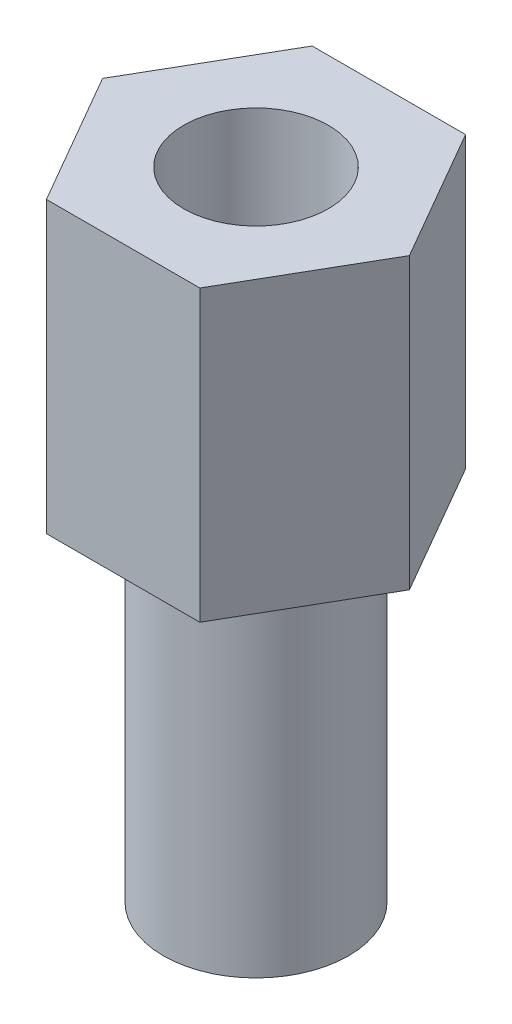
ISO-10303-21;
HEADER;
FILE_DESCRIPTION(('STEP AP214'),'2;1');
FILE_NAME('part.step','',(''),(''),'','','');
FILE_SCHEMA(('AUTOMOTIVE_DESIGN { 1 0 10303 214 1 1 1 1 }'));
ENDSEC;
DATA;
#1=APPLICATION_CONTEXT('core data for automotive mechanical design processes');
#2=APPLICATION_PROTOCOL_DEFINITION('international standard','automotive_design',2000,#1);
#3=PRODUCT_CONTEXT('',#1,'mechanical');
#4=PRODUCT('Part','Part','',(#3));
#5=PRODUCT_RELATED_PRODUCT_CATEGORY('part','',(#4));
#6=PRODUCT_DEFINITION_FORMATION('','',#4);
#7=PRODUCT_DEFINITION_CONTEXT('part definition',#1,'design');
#8=PRODUCT_DEFINITION('design','',#6,#7);
#9=PRODUCT_DEFINITION_SHAPE('','',#8);
#10=(LENGTH_UNIT() NAMED_UNIT(*) SI_UNIT(.MILLI.,.METRE.));
#11=(NAMED_UNIT(*) PLANE_ANGLE_UNIT() SI_UNIT($,.RADIAN.));
#12=(NAMED_UNIT(*) SI_UNIT($,.STERADIAN.) SOLID_ANGLE_UNIT());
#13=UNCERTAINTY_MEASURE_WITH_UNIT(LENGTH_MEASURE(1.E-05),#10,'distance_accuracy_value','');
#14=(GEOMETRIC_REPRESENTATION_CONTEXT(3) GLOBAL_UNCERTAINTY_ASSIGNED_CONTEXT((#13)) GLOBAL_UNIT_ASSIGNED_CONTEXT((#10,
#11,#12)) REPRESENTATION_CONTEXT('',''));
#15=CARTESIAN_POINT('',(0.,0.,0.));
#16=DIRECTION('',(0.,0.,1.));
#17=DIRECTION('',(1.,0.,0.));
#18=AXIS2_PLACEMENT_3D('',#15,#16,#17);
#19=CARTESIAN_POINT('',(-1.325,5.,2.29496732002876));
#20=DIRECTION('',(0.,0.,-1.));
#21=DIRECTION('',(-1.,0.,0.));
#22=AXIS2_PLACEMENT_3D('',#19,#20,#21);
#23=PLANE('',#22);
#24=DIRECTION('',(1.,0.,0.));
#25=VECTOR('',#24,1.);
#26=CARTESIAN_POINT('',(-1.325,0.,2.29496732002876));
#27=LINE('',#26,#25);
#28=CARTESIAN_POINT('',(-1.325,0.,2.29496732002876));
#29=VERTEX_POINT('',#28);
#30=CARTESIAN_POINT('',(1.325,0.,2.29496732002876));
#31=VERTEX_POINT('',#30);
#32=EDGE_CURVE('E122',#29,#31,#27,.T.);
#33=ORIENTED_EDGE('',*,*,#32,.T.);
#34=DIRECTION('',(0.,-1.,0.));
#35=VECTOR('',#34,1.);
#36=CARTESIAN_POINT('',(1.325,5.,2.29496732002876));
#37=LINE('',#36,#35);
#38=CARTESIAN_POINT('',(1.325,5.,2.29496732002876));
#39=VERTEX_POINT('',#38);
#40=EDGE_CURVE('E45',#39,#31,#37,.T.);
#41=ORIENTED_EDGE('',*,*,#40,.F.);
#42=DIRECTION('',(1.,0.,0.));
#43=VECTOR('',#42,1.);
#44=CARTESIAN_POINT('',(-1.325,5.,2.29496732002876));
#45=LINE('',#44,#43);
#46=CARTESIAN_POINT('',(-1.325,5.,2.29496732002876));
#47=VERTEX_POINT('',#46);
#48=EDGE_CURVE('E133',#47,#39,#45,.T.);
#49=ORIENTED_EDGE('',*,*,#48,.F.);
#50=DIRECTION('',(0.,-1.,0.));
#51=VECTOR('',#50,1.);
#52=CARTESIAN_POINT('',(-1.325,5.,2.29496732002876));
#53=LINE('',#52,#51);
#54=EDGE_CURVE('E118',#47,#29,#53,.T.);
#55=ORIENTED_EDGE('',*,*,#54,.T.);
#56=EDGE_LOOP('',(#33,#41,#49,#55));
#57=FACE_BOUND('',#56,.T.);
#58=ADVANCED_FACE('F37',(#57),#23,.F.);
#59=CARTESIAN_POINT('',(1.325,5.,2.29496732002876));
#60=DIRECTION('',(-0.866025403784439,0.,-0.5));
#61=DIRECTION('',(-0.5,0.,0.866025403784439));
#62=AXIS2_PLACEMENT_3D('',#59,#60,#61);
#63=PLANE('',#62);
#64=DIRECTION('',(0.5,0.,-0.866025403784439));
#65=VECTOR('',#64,1.);
#66=CARTESIAN_POINT('',(1.325,0.,2.29496732002876));
#67=LINE('',#66,#65);
#68=CARTESIAN_POINT('',(2.65,0.,0.));
#69=VERTEX_POINT('',#68);
#70=EDGE_CURVE('E125',#31,#69,#67,.T.);
#71=ORIENTED_EDGE('',*,*,#70,.T.);
#72=DIRECTION('',(0.,-1.,0.));
#73=VECTOR('',#72,1.);
#74=CARTESIAN_POINT('',(2.65,5.,0.));
#75=LINE('',#74,#73);
#76=CARTESIAN_POINT('',(2.65,5.,0.));
#77=VERTEX_POINT('',#76);
#78=EDGE_CURVE('E137',#77,#69,#75,.T.);
#79=ORIENTED_EDGE('',*,*,#78,.F.);
#80=DIRECTION('',(0.5,0.,-0.866025403784439));
#81=VECTOR('',#80,1.);
#82=CARTESIAN_POINT('',(1.325,5.,2.29496732002876));
#83=LINE('',#82,#81);
#84=EDGE_CURVE('E91',#39,#77,#83,.T.);
#85=ORIENTED_EDGE('',*,*,#84,.F.);
#86=ORIENTED_EDGE('',*,*,#40,.T.);
#87=EDGE_LOOP('',(#71,#79,#85,#86));
#88=FACE_BOUND('',#87,.T.);
#89=ADVANCED_FACE('F140',(#88),#63,.F.);
#90=CARTESIAN_POINT('',(2.65,5.,0.));
#91=DIRECTION('',(-0.866025403784438,0.,0.5));
#92=DIRECTION('',(0.5,0.,0.866025403784439));
#93=AXIS2_PLACEMENT_3D('',#90,#91,#92);
#94=PLANE('',#93);
#95=DIRECTION('',(-0.5,0.,-0.866025403784439));
#96=VECTOR('',#95,1.);
#97=CARTESIAN_POINT('',(2.65,0.,0.));
#98=LINE('',#97,#96);
#99=CARTESIAN_POINT('',(1.325,0.,-2.29496732002876));
#100=VERTEX_POINT('',#99);
#101=EDGE_CURVE('E128',#69,#100,#98,.T.);
#102=ORIENTED_EDGE('',*,*,#101,.T.);
#103=DIRECTION('',(0.,-1.,0.));
#104=VECTOR('',#103,1.);
#105=CARTESIAN_POINT('',(1.325,5.,-2.29496732002876));
#106=LINE('',#105,#104);
#107=CARTESIAN_POINT('',(1.325,5.,-2.29496732002876));
#108=VERTEX_POINT('',#107);
#109=EDGE_CURVE('E113',#108,#100,#106,.T.);
#110=ORIENTED_EDGE('',*,*,#109,.F.);
#111=DIRECTION('',(-0.5,0.,-0.866025403784439));
#112=VECTOR('',#111,1.);
#113=CARTESIAN_POINT('',(2.65,5.,0.));
#114=LINE('',#113,#112);
#115=EDGE_CURVE('E104',#77,#108,#114,.T.);
#116=ORIENTED_EDGE('',*,*,#115,.F.);
#117=ORIENTED_EDGE('',*,*,#78,.T.);
#118=EDGE_LOOP('',(#102,#110,#116,#117));
#119=FACE_BOUND('',#118,.T.);
#120=ADVANCED_FACE('F148',(#119),#94,.F.);
#121=CARTESIAN_POINT('',(1.325,5.,-2.29496732002876));
#122=DIRECTION('',(0.,0.,1.));
#123=DIRECTION('',(1.,0.,0.));
#124=AXIS2_PLACEMENT_3D('',#121,#122,#123);
#125=PLANE('',#124);
#126=DIRECTION('',(-1.,0.,0.));
#127=VECTOR('',#126,1.);
#128=CARTESIAN_POINT('',(1.325,0.,-2.29496732002876));
#129=LINE('',#128,#127);
#130=CARTESIAN_POINT('',(-1.325,0.,-2.29496732002876));
#131=VERTEX_POINT('',#130);
#132=EDGE_CURVE('E112',#100,#131,#129,.T.);
#133=ORIENTED_EDGE('',*,*,#132,.T.);
#134=DIRECTION('',(0.,-1.,0.));
#135=VECTOR('',#134,1.);
#136=CARTESIAN_POINT('',(-1.325,5.,-2.29496732002876));
#137=LINE('',#136,#135);
#138=CARTESIAN_POINT('',(-1.325,5.,-2.29496732002876));
#139=VERTEX_POINT('',#138);
#140=EDGE_CURVE('E109',#139,#131,#137,.T.);
#141=ORIENTED_EDGE('',*,*,#140,.F.);
#142=DIRECTION('',(-1.,0.,0.));
#143=VECTOR('',#142,1.);
#144=CARTESIAN_POINT('',(1.325,5.,-2.29496732002876));
#145=LINE('',#144,#143);
#146=EDGE_CURVE('E98',#108,#139,#145,.T.);
#147=ORIENTED_EDGE('',*,*,#146,.F.);
#148=ORIENTED_EDGE('',*,*,#109,.T.);
#149=EDGE_LOOP('',(#133,#141,#147,#148));
#150=FACE_BOUND('',#149,.T.);
#151=ADVANCED_FACE('F110',(#150),#125,.F.);
#152=CARTESIAN_POINT('',(-1.325,5.,-2.29496732002876));
#153=DIRECTION('',(0.866025403784439,0.,0.5));
#154=DIRECTION('',(0.5,0.,-0.866025403784439));
#155=AXIS2_PLACEMENT_3D('',#152,#153,#154);
#156=PLANE('',#155);
#157=DIRECTION('',(-0.5,0.,0.866025403784439));
#158=VECTOR('',#157,1.);
#159=CARTESIAN_POINT('',(-1.325,0.,-2.29496732002876));
#160=LINE('',#159,#158);
#161=CARTESIAN_POINT('',(-2.65,0.,0.));
#162=VERTEX_POINT('',#161);
#163=EDGE_CURVE('E76',#131,#162,#160,.T.);
#164=ORIENTED_EDGE('',*,*,#163,.T.);
#165=DIRECTION('',(0.,-1.,0.));
#166=VECTOR('',#165,1.);
#167=CARTESIAN_POINT('',(-2.65,5.,0.));
#168=LINE('',#167,#166);
#169=CARTESIAN_POINT('',(-2.65,5.,0.));
#170=VERTEX_POINT('',#169);
#171=EDGE_CURVE('E114',#170,#162,#168,.T.);
#172=ORIENTED_EDGE('',*,*,#171,.F.);
#173=DIRECTION('',(-0.5,0.,0.866025403784439));
#174=VECTOR('',#173,1.);
#175=CARTESIAN_POINT('',(-1.325,5.,-2.29496732002876));
#176=LINE('',#175,#174);
#177=EDGE_CURVE('E102',#139,#170,#176,.T.);
#178=ORIENTED_EDGE('',*,*,#177,.F.);
#179=ORIENTED_EDGE('',*,*,#140,.T.);
#180=EDGE_LOOP('',(#164,#172,#178,#179));
#181=FACE_BOUND('',#180,.T.);
#182=ADVANCED_FACE('F116',(#181),#156,.F.);
#183=CARTESIAN_POINT('',(-2.65,5.,0.));
#184=DIRECTION('',(0.866025403784438,0.,-0.5));
#185=DIRECTION('',(-0.5,0.,-0.866025403784439));
#186=AXIS2_PLACEMENT_3D('',#183,#184,#185);
#187=PLANE('',#186);
#188=DIRECTION('',(0.5,0.,0.866025403784439));
#189=VECTOR('',#188,1.);
#190=CARTESIAN_POINT('',(-2.65,0.,0.));
#191=LINE('',#190,#189);
#192=EDGE_CURVE('E82',#162,#29,#191,.T.);
#193=ORIENTED_EDGE('',*,*,#192,.T.);
#194=ORIENTED_EDGE('',*,*,#54,.F.);
#195=DIRECTION('',(0.5,0.,0.866025403784439));
#196=VECTOR('',#195,1.);
#197=CARTESIAN_POINT('',(-2.65,5.,0.));
#198=LINE('',#197,#196);
#199=EDGE_CURVE('E53',#170,#47,#198,.T.);
#200=ORIENTED_EDGE('',*,*,#199,.F.);
#201=ORIENTED_EDGE('',*,*,#171,.T.);
#202=EDGE_LOOP('',(#193,#194,#200,#201));
#203=FACE_BOUND('',#202,.T.);
#204=ADVANCED_FACE('F171',(#203),#187,.F.);
#205=CARTESIAN_POINT('',(0.,5.,0.));
#206=DIRECTION('',(0.,1.,0.));
#207=DIRECTION('',(0.,0.,1.));
#208=AXIS2_PLACEMENT_3D('',#205,#206,#207);
#209=PLANE('',#208);
#210=CARTESIAN_POINT('',(0.,5.,0.));
#211=DIRECTION('',(0.,1.,0.));
#212=DIRECTION('',(0.,0.,1.));
#213=AXIS2_PLACEMENT_3D('',#210,#211,#212);
#214=CIRCLE('',#213,1.25);
#215=CARTESIAN_POINT('',(0.,5.,1.25));
#216=VERTEX_POINT('',#215);
#217=EDGE_CURVE('E155',#216,#216,#214,.T.);
#218=ORIENTED_EDGE('',*,*,#217,.F.);
#219=EDGE_LOOP('',(#218));
#220=FACE_BOUND('',#219,.T.);
#221=ORIENTED_EDGE('',*,*,#48,.T.);
#222=ORIENTED_EDGE('',*,*,#84,.T.);
#223=ORIENTED_EDGE('',*,*,#115,.T.);
#224=ORIENTED_EDGE('',*,*,#146,.T.);
#225=ORIENTED_EDGE('',*,*,#177,.T.);
#226=ORIENTED_EDGE('',*,*,#199,.T.);
#227=EDGE_LOOP('',(#221,#222,#223,#224,#225,#226));
#228=FACE_BOUND('',#227,.T.);
#229=ADVANCED_FACE('F100',(#220,#228),#209,.T.);
#230=CARTESIAN_POINT('',(0.,0.,0.));
#231=DIRECTION('',(0.,1.,0.));
#232=DIRECTION('',(0.,0.,1.));
#233=AXIS2_PLACEMENT_3D('',#230,#231,#232);
#234=PLANE('',#233);
#235=CARTESIAN_POINT('',(0.,0.,0.));
#236=DIRECTION('',(0.,1.,0.));
#237=DIRECTION('',(0.,0.,1.));
#238=AXIS2_PLACEMENT_3D('',#235,#236,#237);
#239=CIRCLE('',#238,1.6);
#240=CARTESIAN_POINT('',(0.,0.,1.6));
#241=VERTEX_POINT('',#240);
#242=EDGE_CURVE('E11',#241,#241,#239,.F.);
#243=ORIENTED_EDGE('',*,*,#242,.F.);
#244=EDGE_LOOP('',(#243));
#245=FACE_BOUND('',#244,.T.);
#246=ORIENTED_EDGE('',*,*,#32,.F.);
#247=ORIENTED_EDGE('',*,*,#192,.F.);
#248=ORIENTED_EDGE('',*,*,#163,.F.);
#249=ORIENTED_EDGE('',*,*,#132,.F.);
#250=ORIENTED_EDGE('',*,*,#101,.F.);
#251=ORIENTED_EDGE('',*,*,#70,.F.);
#252=EDGE_LOOP('',(#246,#247,#248,#249,#250,#251));
#253=FACE_BOUND('',#252,.T.);
#254=ADVANCED_FACE('F145',(#245,#253),#234,.F.);
#255=CARTESIAN_POINT('',(0.,-6.,0.));
#256=DIRECTION('',(0.,1.,0.));
#257=DIRECTION('',(0.,0.,1.));
#258=AXIS2_PLACEMENT_3D('',#255,#256,#257);
#259=CYLINDRICAL_SURFACE('',#258,1.6);
#260=CARTESIAN_POINT('',(0.,-6.,0.));
#261=DIRECTION('',(0.,-1.,0.));
#262=DIRECTION('',(0.,0.,-1.));
#263=AXIS2_PLACEMENT_3D('',#260,#261,#262);
#264=CIRCLE('',#263,1.6);
#265=CARTESIAN_POINT('',(0.,-6.,-1.6));
#266=VERTEX_POINT('',#265);
#267=EDGE_CURVE('E126',#266,#266,#264,.T.);
#268=ORIENTED_EDGE('',*,*,#267,.F.);
#269=EDGE_LOOP('',(#268));
#270=FACE_BOUND('',#269,.T.);
#271=ORIENTED_EDGE('',*,*,#242,.T.);
#272=EDGE_LOOP('',(#271));
#273=FACE_BOUND('',#272,.T.);
#274=ADVANCED_FACE('F177',(#270,#273),#259,.T.);
#275=CARTESIAN_POINT('',(0.,-6.,0.));
#276=DIRECTION('',(0.,-1.,0.));
#277=DIRECTION('',(0.,0.,-1.));
#278=AXIS2_PLACEMENT_3D('',#275,#276,#277);
#279=PLANE('',#278);
#280=ORIENTED_EDGE('',*,*,#267,.T.);
#281=EDGE_LOOP('',(#280));
#282=FACE_BOUND('',#281,.T.);
#283=ADVANCED_FACE('F166',(#282),#279,.T.);
#284=CARTESIAN_POINT('',(0.,0.,0.));
#285=DIRECTION('',(0.,1.,0.));
#286=DIRECTION('',(0.,0.,1.));
#287=AXIS2_PLACEMENT_3D('',#284,#285,#286);
#288=CYLINDRICAL_SURFACE('',#287,1.25);
#289=CARTESIAN_POINT('',(0.,0.,0.));
#290=DIRECTION('',(0.,1.,0.));
#291=DIRECTION('',(0.,0.,1.));
#292=AXIS2_PLACEMENT_3D('',#289,#290,#291);
#293=CIRCLE('',#292,1.25);
#294=CARTESIAN_POINT('',(0.,0.,1.25));
#295=VERTEX_POINT('',#294);
#296=EDGE_CURVE('E154',#295,#295,#293,.T.);
#297=ORIENTED_EDGE('',*,*,#296,.F.);
#298=EDGE_LOOP('',(#297));
#299=FACE_BOUND('',#298,.T.);
#300=ORIENTED_EDGE('',*,*,#217,.T.);
#301=EDGE_LOOP('',(#300));
#302=FACE_BOUND('',#301,.T.);
#303=ADVANCED_FACE('F163',(#299,#302),#288,.F.);
#304=CARTESIAN_POINT('',(0.,0.,0.));
#305=DIRECTION('',(0.,1.,0.));
#306=DIRECTION('',(0.,0.,1.));
#307=AXIS2_PLACEMENT_3D('',#304,#305,#306);
#308=PLANE('',#307);
#309=ORIENTED_EDGE('',*,*,#296,.T.);
#310=EDGE_LOOP('',(#309));
#311=FACE_BOUND('',#310,.T.);
#312=ADVANCED_FACE('F161',(#311),#308,.T.);
#313=CLOSED_SHELL('',(#58,#89,#120,#151,#182,#204,#229,#254,#274,#283,#303,#312));
#314=MANIFOLD_SOLID_BREP('B2',#313);
#315=ADVANCED_BREP_SHAPE_REPRESENTATION('',(#18,#314),#14);
#316=SHAPE_DEFINITION_REPRESENTATION(#9,#315);
ENDSEC;
END-ISO-10303-21;
